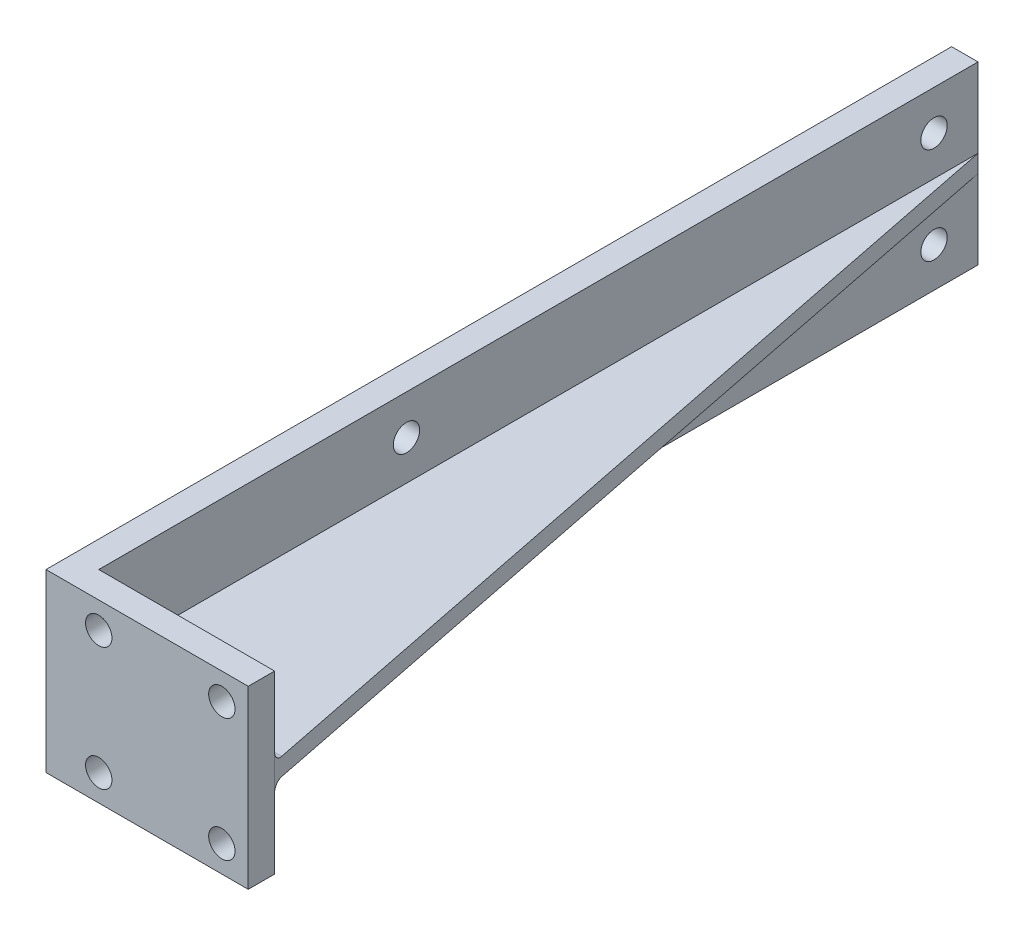
ISO-10303-21;
HEADER;
FILE_DESCRIPTION(('STEP AP214'),'2;1');
FILE_NAME('part.step','',(''),(''),'','','');
FILE_SCHEMA(('AUTOMOTIVE_DESIGN { 1 0 10303 214 1 1 1 1 }'));
ENDSEC;
DATA;
#1=APPLICATION_CONTEXT('core data for automotive mechanical design processes');
#2=APPLICATION_PROTOCOL_DEFINITION('international standard','automotive_design',2000,#1);
#3=PRODUCT_CONTEXT('',#1,'mechanical');
#4=PRODUCT('Part','Part','',(#3));
#5=PRODUCT_RELATED_PRODUCT_CATEGORY('part','',(#4));
#6=PRODUCT_DEFINITION_FORMATION('','',#4);
#7=PRODUCT_DEFINITION_CONTEXT('part definition',#1,'design');
#8=PRODUCT_DEFINITION('design','',#6,#7);
#9=PRODUCT_DEFINITION_SHAPE('','',#8);
#10=(LENGTH_UNIT() NAMED_UNIT(*) SI_UNIT(.MILLI.,.METRE.));
#11=(NAMED_UNIT(*) PLANE_ANGLE_UNIT() SI_UNIT($,.RADIAN.));
#12=(NAMED_UNIT(*) SI_UNIT($,.STERADIAN.) SOLID_ANGLE_UNIT());
#13=UNCERTAINTY_MEASURE_WITH_UNIT(LENGTH_MEASURE(1.E-05),#10,'distance_accuracy_value','');
#14=(GEOMETRIC_REPRESENTATION_CONTEXT(3) GLOBAL_UNCERTAINTY_ASSIGNED_CONTEXT((#13)) GLOBAL_UNIT_ASSIGNED_CONTEXT((#10,
#11,#12)) REPRESENTATION_CONTEXT('',''));
#15=CARTESIAN_POINT('',(0.,0.,0.));
#16=DIRECTION('',(0.,0.,1.));
#17=DIRECTION('',(1.,0.,0.));
#18=AXIS2_PLACEMENT_3D('',#15,#16,#17);
#19=CARTESIAN_POINT('',(20.,2.,0.));
#20=DIRECTION('',(-0.98058067569092,0.,0.196116135138184));
#21=DIRECTION('',(0.196116135138184,0.,0.98058067569092));
#22=AXIS2_PLACEMENT_3D('',#19,#20,#21);
#23=PLANE('',#22);
#24=DIRECTION('',(0.,-1.,0.));
#25=VECTOR('',#24,1.);
#26=CARTESIAN_POINT('',(20.,2.,0.));
#27=LINE('',#26,#25);
#28=CARTESIAN_POINT('',(20.,3.,0.));
#29=VERTEX_POINT('',#28);
#30=CARTESIAN_POINT('',(20.,-1.,0.));
#31=VERTEX_POINT('',#30);
#32=EDGE_CURVE('E51',#29,#31,#27,.T.);
#33=ORIENTED_EDGE('',*,*,#32,.T.);
#34=CARTESIAN_POINT('',(19.8,-1.,-1.));
#35=DIRECTION('',(-0.98058067569092,0.,0.196116135138184));
#36=DIRECTION('',(-0.196116135138184,0.,-0.98058067569092));
#37=AXIS2_PLACEMENT_3D('',#34,#35,#36);
#38=ELLIPSE('',#37,1.01980390271856,1.);
#39=CARTESIAN_POINT('',(19.8,0.,-1.));
#40=VERTEX_POINT('',#39);
#41=EDGE_CURVE('E11',#31,#40,#38,.T.);
#42=ORIENTED_EDGE('',*,*,#41,.T.);
#43=DIRECTION('',(-0.196116135138184,0.,-0.98058067569092));
#44=VECTOR('',#43,1.);
#45=CARTESIAN_POINT('',(20.,0.,0.));
#46=LINE('',#45,#44);
#47=CARTESIAN_POINT('',(0.,0.,-100.));
#48=VERTEX_POINT('',#47);
#49=EDGE_CURVE('E172',#40,#48,#46,.T.);
#50=ORIENTED_EDGE('',*,*,#49,.T.);
#51=DIRECTION('',(0.,-1.,0.));
#52=VECTOR('',#51,1.);
#53=CARTESIAN_POINT('',(0.,2.,-100.));
#54=LINE('',#53,#52);
#55=CARTESIAN_POINT('',(0.,2.,-100.));
#56=VERTEX_POINT('',#55);
#57=EDGE_CURVE('E193',#56,#48,#54,.T.);
#58=ORIENTED_EDGE('',*,*,#57,.F.);
#59=DIRECTION('',(-0.196116135138184,0.,-0.98058067569092));
#60=VECTOR('',#59,1.);
#61=CARTESIAN_POINT('',(20.,2.,0.));
#62=LINE('',#61,#60);
#63=CARTESIAN_POINT('',(19.8,2.,-1.));
#64=VERTEX_POINT('',#63);
#65=EDGE_CURVE('E183',#64,#56,#62,.T.);
#66=ORIENTED_EDGE('',*,*,#65,.F.);
#67=CARTESIAN_POINT('',(19.8,3.,-1.));
#68=DIRECTION('',(-0.98058067569092,0.,0.196116135138184));
#69=DIRECTION('',(0.196116135138184,0.,0.98058067569092));
#70=AXIS2_PLACEMENT_3D('',#67,#68,#69);
#71=ELLIPSE('',#70,1.01980390271856,1.);
#72=EDGE_CURVE('E44',#64,#29,#71,.T.);
#73=ORIENTED_EDGE('',*,*,#72,.T.);
#74=EDGE_LOOP('',(#33,#42,#50,#58,#66,#73));
#75=FACE_BOUND('',#74,.T.);
#76=ADVANCED_FACE('F35',(#75),#23,.F.);
#77=CARTESIAN_POINT('',(0.,2.,0.));
#78=DIRECTION('',(0.,-1.,0.));
#79=DIRECTION('',(0.,0.,-1.));
#80=AXIS2_PLACEMENT_3D('',#77,#78,#79);
#81=PLANE('',#80);
#82=DIRECTION('',(0.,0.,1.));
#83=VECTOR('',#82,1.);
#84=CARTESIAN_POINT('',(0.,2.,-100.));
#85=LINE('',#84,#83);
#86=CARTESIAN_POINT('',(0.,2.,-1.));
#87=VERTEX_POINT('',#86);
#88=EDGE_CURVE('E185',#56,#87,#85,.T.);
#89=ORIENTED_EDGE('',*,*,#88,.T.);
#90=DIRECTION('',(1.,0.,0.));
#91=VECTOR('',#90,1.);
#92=CARTESIAN_POINT('',(0.,2.,-1.));
#93=LINE('',#92,#91);
#94=EDGE_CURVE('E196',#87,#64,#93,.T.);
#95=ORIENTED_EDGE('',*,*,#94,.T.);
#96=ORIENTED_EDGE('',*,*,#65,.T.);
#97=EDGE_LOOP('',(#89,#95,#96));
#98=FACE_BOUND('',#97,.T.);
#99=ADVANCED_FACE('F249',(#98),#81,.F.);
#100=CARTESIAN_POINT('',(0.,0.,0.));
#101=DIRECTION('',(0.,-1.,0.));
#102=DIRECTION('',(0.,0.,-1.));
#103=AXIS2_PLACEMENT_3D('',#100,#101,#102);
#104=PLANE('',#103);
#105=ORIENTED_EDGE('',*,*,#49,.F.);
#106=DIRECTION('',(1.,0.,0.));
#107=VECTOR('',#106,1.);
#108=CARTESIAN_POINT('',(0.,0.,-1.));
#109=LINE('',#108,#107);
#110=CARTESIAN_POINT('',(0.,0.,-1.));
#111=VERTEX_POINT('',#110);
#112=EDGE_CURVE('E204',#40,#111,#109,.F.);
#113=ORIENTED_EDGE('',*,*,#112,.T.);
#114=DIRECTION('',(0.,0.,1.));
#115=VECTOR('',#114,1.);
#116=CARTESIAN_POINT('',(0.,0.,-100.));
#117=LINE('',#116,#115);
#118=EDGE_CURVE('E186',#48,#111,#117,.T.);
#119=ORIENTED_EDGE('',*,*,#118,.F.);
#120=EDGE_LOOP('',(#105,#113,#119));
#121=FACE_BOUND('',#120,.T.);
#122=ADVANCED_FACE('F247',(#121),#104,.T.);
#123=CARTESIAN_POINT('',(20.,11.,0.));
#124=DIRECTION('',(0.,0.,-1.));
#125=DIRECTION('',(-1.,0.,0.));
#126=AXIS2_PLACEMENT_3D('',#123,#124,#125);
#127=PLANE('',#126);
#128=CARTESIAN_POINT('',(3.,8.,0.));
#129=DIRECTION('',(0.,0.,-1.));
#130=DIRECTION('',(1.,0.,0.));
#131=AXIS2_PLACEMENT_3D('',#128,#129,#130);
#132=CIRCLE('',#131,1.5);
#133=CARTESIAN_POINT('',(4.5,8.,0.));
#134=VERTEX_POINT('',#133);
#135=EDGE_CURVE('E345',#134,#134,#132,.T.);
#136=ORIENTED_EDGE('',*,*,#135,.F.);
#137=EDGE_LOOP('',(#136));
#138=FACE_BOUND('',#137,.T.);
#139=CARTESIAN_POINT('',(17.,8.,0.));
#140=DIRECTION('',(0.,0.,-1.));
#141=DIRECTION('',(-1.,0.,0.));
#142=AXIS2_PLACEMENT_3D('',#139,#140,#141);
#143=CIRCLE('',#142,1.5);
#144=CARTESIAN_POINT('',(15.5,8.,0.));
#145=VERTEX_POINT('',#144);
#146=EDGE_CURVE('E336',#145,#145,#143,.T.);
#147=ORIENTED_EDGE('',*,*,#146,.F.);
#148=EDGE_LOOP('',(#147));
#149=FACE_BOUND('',#148,.T.);
#150=DIRECTION('',(0.,-1.,0.));
#151=VECTOR('',#150,1.);
#152=CARTESIAN_POINT('',(20.,11.,0.));
#153=LINE('',#152,#151);
#154=CARTESIAN_POINT('',(20.,11.,0.));
#155=VERTEX_POINT('',#154);
#156=EDGE_CURVE('E121',#155,#29,#153,.T.);
#157=ORIENTED_EDGE('',*,*,#156,.T.);
#158=DIRECTION('',(1.,0.,0.));
#159=VECTOR('',#158,1.);
#160=CARTESIAN_POINT('',(20.,3.,0.));
#161=LINE('',#160,#159);
#162=CARTESIAN_POINT('',(0.,3.,0.));
#163=VERTEX_POINT('',#162);
#164=EDGE_CURVE('E199',#29,#163,#161,.F.);
#165=ORIENTED_EDGE('',*,*,#164,.T.);
#166=DIRECTION('',(0.,-1.,0.));
#167=VECTOR('',#166,1.);
#168=CARTESIAN_POINT('',(0.,11.,0.));
#169=LINE('',#168,#167);
#170=CARTESIAN_POINT('',(0.,11.,0.));
#171=VERTEX_POINT('',#170);
#172=EDGE_CURVE('E169',#171,#163,#169,.T.);
#173=ORIENTED_EDGE('',*,*,#172,.F.);
#174=DIRECTION('',(1.,0.,0.));
#175=VECTOR('',#174,1.);
#176=CARTESIAN_POINT('',(20.,11.,0.));
#177=LINE('',#176,#175);
#178=EDGE_CURVE('E153',#171,#155,#177,.T.);
#179=ORIENTED_EDGE('',*,*,#178,.T.);
#180=EDGE_LOOP('',(#157,#165,#173,#179));
#181=FACE_BOUND('',#180,.T.);
#182=ADVANCED_FACE('F218',(#138,#149,#181),#127,.T.);
#183=CARTESIAN_POINT('',(0.,11.,0.));
#184=DIRECTION('',(1.,0.,0.));
#185=DIRECTION('',(0.,0.,-1.));
#186=AXIS2_PLACEMENT_3D('',#183,#184,#185);
#187=PLANE('',#186);
#188=CARTESIAN_POINT('',(0.,6.49999999999999,-35.));
#189=DIRECTION('',(1.,0.,0.));
#190=DIRECTION('',(0.,0.,-1.));
#191=AXIS2_PLACEMENT_3D('',#188,#189,#190);
#192=CIRCLE('',#191,1.5);
#193=CARTESIAN_POINT('',(0.,6.49999999999999,-36.5));
#194=VERTEX_POINT('',#193);
#195=EDGE_CURVE('E363',#194,#194,#192,.T.);
#196=ORIENTED_EDGE('',*,*,#195,.F.);
#197=EDGE_LOOP('',(#196));
#198=FACE_BOUND('',#197,.T.);
#199=CARTESIAN_POINT('',(0.,6.5,-95.));
#200=DIRECTION('',(1.,0.,0.));
#201=DIRECTION('',(0.,0.,-1.));
#202=AXIS2_PLACEMENT_3D('',#199,#200,#201);
#203=CIRCLE('',#202,1.5);
#204=CARTESIAN_POINT('',(0.,6.5,-96.5));
#205=VERTEX_POINT('',#204);
#206=EDGE_CURVE('E142',#205,#205,#203,.T.);
#207=ORIENTED_EDGE('',*,*,#206,.F.);
#208=EDGE_LOOP('',(#207));
#209=FACE_BOUND('',#208,.T.);
#210=ORIENTED_EDGE('',*,*,#172,.T.);
#211=CARTESIAN_POINT('',(0.,3.,-1.));
#212=DIRECTION('',(1.,0.,0.));
#213=DIRECTION('',(0.,0.,-1.));
#214=AXIS2_PLACEMENT_3D('',#211,#212,#213);
#215=CIRCLE('',#214,1.);
#216=EDGE_CURVE('E201',#163,#87,#215,.T.);
#217=ORIENTED_EDGE('',*,*,#216,.T.);
#218=ORIENTED_EDGE('',*,*,#88,.F.);
#219=DIRECTION('',(0.,-1.,0.));
#220=VECTOR('',#219,1.);
#221=CARTESIAN_POINT('',(0.,11.,-100.));
#222=LINE('',#221,#220);
#223=CARTESIAN_POINT('',(0.,11.,-100.));
#224=VERTEX_POINT('',#223);
#225=EDGE_CURVE('E174',#224,#56,#222,.T.);
#226=ORIENTED_EDGE('',*,*,#225,.F.);
#227=DIRECTION('',(0.,0.,1.));
#228=VECTOR('',#227,1.);
#229=CARTESIAN_POINT('',(0.,11.,0.));
#230=LINE('',#229,#228);
#231=EDGE_CURVE('E122',#224,#171,#230,.T.);
#232=ORIENTED_EDGE('',*,*,#231,.T.);
#233=EDGE_LOOP('',(#210,#217,#218,#226,#232));
#234=FACE_BOUND('',#233,.T.);
#235=ADVANCED_FACE('F221',(#198,#209,#234),#187,.T.);
#236=CARTESIAN_POINT('',(3.,-6.,0.));
#237=DIRECTION('',(0.,0.,-1.));
#238=DIRECTION('',(-1.,0.,0.));
#239=AXIS2_PLACEMENT_3D('',#236,#237,#238);
#240=CIRCLE('',#239,1.5);
#241=CARTESIAN_POINT('',(1.5,-6.,0.));
#242=VERTEX_POINT('',#241);
#243=EDGE_CURVE('E327',#242,#242,#240,.T.);
#244=ORIENTED_EDGE('',*,*,#243,.F.);
#245=EDGE_LOOP('',(#244));
#246=FACE_BOUND('',#245,.T.);
#247=CARTESIAN_POINT('',(17.,-6.,0.));
#248=DIRECTION('',(0.,0.,-1.));
#249=DIRECTION('',(1.,0.,0.));
#250=AXIS2_PLACEMENT_3D('',#247,#248,#249);
#251=CIRCLE('',#250,1.5);
#252=CARTESIAN_POINT('',(18.5,-6.,0.));
#253=VERTEX_POINT('',#252);
#254=EDGE_CURVE('E330',#253,#253,#251,.T.);
#255=ORIENTED_EDGE('',*,*,#254,.F.);
#256=EDGE_LOOP('',(#255));
#257=FACE_BOUND('',#256,.T.);
#258=CARTESIAN_POINT('',(0.,-1.,0.));
#259=VERTEX_POINT('',#258);
#260=CARTESIAN_POINT('',(0.,-9.,0.));
#261=VERTEX_POINT('',#260);
#262=EDGE_CURVE('E173',#259,#261,#169,.T.);
#263=ORIENTED_EDGE('',*,*,#262,.F.);
#264=DIRECTION('',(1.,0.,0.));
#265=VECTOR('',#264,1.);
#266=CARTESIAN_POINT('',(20.,-1.,0.));
#267=LINE('',#266,#265);
#268=EDGE_CURVE('E120',#259,#31,#267,.T.);
#269=ORIENTED_EDGE('',*,*,#268,.T.);
#270=CARTESIAN_POINT('',(20.,-9.,0.));
#271=VERTEX_POINT('',#270);
#272=EDGE_CURVE('E113',#31,#271,#153,.T.);
#273=ORIENTED_EDGE('',*,*,#272,.T.);
#274=DIRECTION('',(1.,0.,0.));
#275=VECTOR('',#274,1.);
#276=CARTESIAN_POINT('',(20.,-9.,0.));
#277=LINE('',#276,#275);
#278=EDGE_CURVE('E118',#261,#271,#277,.T.);
#279=ORIENTED_EDGE('',*,*,#278,.F.);
#280=EDGE_LOOP('',(#263,#269,#273,#279));
#281=FACE_BOUND('',#280,.T.);
#282=ADVANCED_FACE('F116',(#246,#257,#281),#127,.T.);
#283=CARTESIAN_POINT('',(0.,-4.5,-95.));
#284=DIRECTION('',(1.,0.,0.));
#285=DIRECTION('',(0.,0.,1.));
#286=AXIS2_PLACEMENT_3D('',#283,#284,#285);
#287=CIRCLE('',#286,1.5);
#288=CARTESIAN_POINT('',(0.,-4.5,-93.5));
#289=VERTEX_POINT('',#288);
#290=EDGE_CURVE('E357',#289,#289,#287,.T.);
#291=ORIENTED_EDGE('',*,*,#290,.F.);
#292=EDGE_LOOP('',(#291));
#293=FACE_BOUND('',#292,.T.);
#294=CARTESIAN_POINT('',(0.,-4.50000000000001,-35.));
#295=DIRECTION('',(1.,0.,0.));
#296=DIRECTION('',(0.,0.,1.));
#297=AXIS2_PLACEMENT_3D('',#294,#295,#296);
#298=CIRCLE('',#297,1.5);
#299=CARTESIAN_POINT('',(0.,-4.50000000000001,-33.5));
#300=VERTEX_POINT('',#299);
#301=EDGE_CURVE('E351',#300,#300,#298,.T.);
#302=ORIENTED_EDGE('',*,*,#301,.F.);
#303=EDGE_LOOP('',(#302));
#304=FACE_BOUND('',#303,.T.);
#305=ORIENTED_EDGE('',*,*,#118,.T.);
#306=CARTESIAN_POINT('',(0.,-1.,-1.));
#307=DIRECTION('',(1.,0.,0.));
#308=DIRECTION('',(0.,0.,-1.));
#309=AXIS2_PLACEMENT_3D('',#306,#307,#308);
#310=CIRCLE('',#309,1.);
#311=EDGE_CURVE('E206',#111,#259,#310,.T.);
#312=ORIENTED_EDGE('',*,*,#311,.T.);
#313=ORIENTED_EDGE('',*,*,#262,.T.);
#314=DIRECTION('',(0.,0.,1.));
#315=VECTOR('',#314,1.);
#316=CARTESIAN_POINT('',(0.,-9.,0.));
#317=LINE('',#316,#315);
#318=CARTESIAN_POINT('',(0.,-9.,-100.));
#319=VERTEX_POINT('',#318);
#320=EDGE_CURVE('E138',#319,#261,#317,.T.);
#321=ORIENTED_EDGE('',*,*,#320,.F.);
#322=EDGE_CURVE('E177',#48,#319,#222,.T.);
#323=ORIENTED_EDGE('',*,*,#322,.F.);
#324=EDGE_LOOP('',(#305,#312,#313,#321,#323));
#325=FACE_BOUND('',#324,.T.);
#326=ADVANCED_FACE('F240',(#293,#304,#325),#187,.T.);
#327=CARTESIAN_POINT('',(0.,11.,-100.));
#328=DIRECTION('',(0.,0.,-1.));
#329=DIRECTION('',(-1.,0.,0.));
#330=AXIS2_PLACEMENT_3D('',#327,#328,#329);
#331=PLANE('',#330);
#332=ORIENTED_EDGE('',*,*,#225,.T.);
#333=ORIENTED_EDGE('',*,*,#57,.T.);
#334=ORIENTED_EDGE('',*,*,#322,.T.);
#335=DIRECTION('',(1.,0.,0.));
#336=VECTOR('',#335,1.);
#337=CARTESIAN_POINT('',(0.,-9.,-100.));
#338=LINE('',#337,#336);
#339=CARTESIAN_POINT('',(-2.99999999999999,-9.,-100.));
#340=VERTEX_POINT('',#339);
#341=EDGE_CURVE('E150',#340,#319,#338,.T.);
#342=ORIENTED_EDGE('',*,*,#341,.F.);
#343=DIRECTION('',(0.,-1.,0.));
#344=VECTOR('',#343,1.);
#345=CARTESIAN_POINT('',(-2.99999999999999,11.,-100.));
#346=LINE('',#345,#344);
#347=CARTESIAN_POINT('',(-2.99999999999999,11.,-100.));
#348=VERTEX_POINT('',#347);
#349=EDGE_CURVE('E178',#348,#340,#346,.T.);
#350=ORIENTED_EDGE('',*,*,#349,.F.);
#351=DIRECTION('',(1.,0.,0.));
#352=VECTOR('',#351,1.);
#353=CARTESIAN_POINT('',(0.,11.,-100.));
#354=LINE('',#353,#352);
#355=EDGE_CURVE('E164',#348,#224,#354,.T.);
#356=ORIENTED_EDGE('',*,*,#355,.T.);
#357=EDGE_LOOP('',(#332,#333,#334,#342,#350,#356));
#358=FACE_BOUND('',#357,.T.);
#359=ADVANCED_FACE('F237',(#358),#331,.T.);
#360=CARTESIAN_POINT('',(-2.99999999999999,11.,-100.));
#361=DIRECTION('',(-1.,0.,0.));
#362=DIRECTION('',(0.,0.,1.));
#363=AXIS2_PLACEMENT_3D('',#360,#361,#362);
#364=PLANE('',#363);
#365=CARTESIAN_POINT('',(-3.00000000000001,6.49999999999999,-35.));
#366=DIRECTION('',(1.,0.,0.));
#367=DIRECTION('',(0.,0.,-1.));
#368=AXIS2_PLACEMENT_3D('',#365,#366,#367);
#369=CIRCLE('',#368,1.5);
#370=CARTESIAN_POINT('',(-3.00000000000001,6.49999999999999,-36.5));
#371=VERTEX_POINT('',#370);
#372=EDGE_CURVE('E360',#371,#371,#369,.T.);
#373=ORIENTED_EDGE('',*,*,#372,.T.);
#374=EDGE_LOOP('',(#373));
#375=FACE_BOUND('',#374,.T.);
#376=CARTESIAN_POINT('',(-3.00000000000001,-4.5,-95.));
#377=DIRECTION('',(1.,0.,0.));
#378=DIRECTION('',(0.,0.,1.));
#379=AXIS2_PLACEMENT_3D('',#376,#377,#378);
#380=CIRCLE('',#379,1.5);
#381=CARTESIAN_POINT('',(-3.00000000000001,-4.5,-93.5));
#382=VERTEX_POINT('',#381);
#383=EDGE_CURVE('E366',#382,#382,#380,.T.);
#384=ORIENTED_EDGE('',*,*,#383,.T.);
#385=EDGE_LOOP('',(#384));
#386=FACE_BOUND('',#385,.T.);
#387=CARTESIAN_POINT('',(-3.00000000000001,-4.50000000000001,-35.));
#388=DIRECTION('',(1.,0.,0.));
#389=DIRECTION('',(0.,0.,1.));
#390=AXIS2_PLACEMENT_3D('',#387,#388,#389);
#391=CIRCLE('',#390,1.5);
#392=CARTESIAN_POINT('',(-3.00000000000001,-4.50000000000001,-33.5));
#393=VERTEX_POINT('',#392);
#394=EDGE_CURVE('E354',#393,#393,#391,.T.);
#395=ORIENTED_EDGE('',*,*,#394,.T.);
#396=EDGE_LOOP('',(#395));
#397=FACE_BOUND('',#396,.T.);
#398=CARTESIAN_POINT('',(-3.00000000000001,6.5,-95.));
#399=DIRECTION('',(1.,0.,0.));
#400=DIRECTION('',(0.,0.,-1.));
#401=AXIS2_PLACEMENT_3D('',#398,#399,#400);
#402=CIRCLE('',#401,1.5);
#403=CARTESIAN_POINT('',(-3.00000000000001,6.5,-96.5));
#404=VERTEX_POINT('',#403);
#405=EDGE_CURVE('E139',#404,#404,#402,.T.);
#406=ORIENTED_EDGE('',*,*,#405,.T.);
#407=EDGE_LOOP('',(#406));
#408=FACE_BOUND('',#407,.T.);
#409=ORIENTED_EDGE('',*,*,#349,.T.);
#410=DIRECTION('',(0.,0.,-1.));
#411=VECTOR('',#410,1.);
#412=CARTESIAN_POINT('',(-2.99999999999999,-9.,-100.));
#413=LINE('',#412,#411);
#414=CARTESIAN_POINT('',(-3.00000000000001,-9.,3.));
#415=VERTEX_POINT('',#414);
#416=EDGE_CURVE('E147',#415,#340,#413,.T.);
#417=ORIENTED_EDGE('',*,*,#416,.F.);
#418=DIRECTION('',(0.,-1.,0.));
#419=VECTOR('',#418,1.);
#420=CARTESIAN_POINT('',(-3.00000000000001,11.,3.));
#421=LINE('',#420,#419);
#422=CARTESIAN_POINT('',(-3.00000000000001,11.,3.));
#423=VERTEX_POINT('',#422);
#424=EDGE_CURVE('E180',#423,#415,#421,.T.);
#425=ORIENTED_EDGE('',*,*,#424,.F.);
#426=DIRECTION('',(0.,0.,-1.));
#427=VECTOR('',#426,1.);
#428=CARTESIAN_POINT('',(-2.99999999999999,11.,-100.));
#429=LINE('',#428,#427);
#430=EDGE_CURVE('E161',#423,#348,#429,.T.);
#431=ORIENTED_EDGE('',*,*,#430,.T.);
#432=EDGE_LOOP('',(#409,#417,#425,#431));
#433=FACE_BOUND('',#432,.T.);
#434=ADVANCED_FACE('F235',(#375,#386,#397,#408,#433),#364,.T.);
#435=CARTESIAN_POINT('',(20.,11.,3.));
#436=DIRECTION('',(0.,0.,1.));
#437=DIRECTION('',(1.,0.,0.));
#438=AXIS2_PLACEMENT_3D('',#435,#436,#437);
#439=PLANE('',#438);
#440=CARTESIAN_POINT('',(3.,8.,3.));
#441=DIRECTION('',(0.,0.,-1.));
#442=DIRECTION('',(1.,0.,0.));
#443=AXIS2_PLACEMENT_3D('',#440,#441,#442);
#444=CIRCLE('',#443,1.5);
#445=CARTESIAN_POINT('',(4.5,8.,3.));
#446=VERTEX_POINT('',#445);
#447=EDGE_CURVE('E342',#446,#446,#444,.T.);
#448=ORIENTED_EDGE('',*,*,#447,.T.);
#449=EDGE_LOOP('',(#448));
#450=FACE_BOUND('',#449,.T.);
#451=CARTESIAN_POINT('',(3.,-6.,3.));
#452=DIRECTION('',(0.,0.,-1.));
#453=DIRECTION('',(-1.,0.,0.));
#454=AXIS2_PLACEMENT_3D('',#451,#452,#453);
#455=CIRCLE('',#454,1.5);
#456=CARTESIAN_POINT('',(1.5,-6.,3.));
#457=VERTEX_POINT('',#456);
#458=EDGE_CURVE('E333',#457,#457,#455,.T.);
#459=ORIENTED_EDGE('',*,*,#458,.T.);
#460=EDGE_LOOP('',(#459));
#461=FACE_BOUND('',#460,.T.);
#462=CARTESIAN_POINT('',(17.,-6.,3.));
#463=DIRECTION('',(0.,0.,-1.));
#464=DIRECTION('',(1.,0.,0.));
#465=AXIS2_PLACEMENT_3D('',#462,#463,#464);
#466=CIRCLE('',#465,1.5);
#467=CARTESIAN_POINT('',(18.5,-6.,3.));
#468=VERTEX_POINT('',#467);
#469=EDGE_CURVE('E332',#468,#468,#466,.T.);
#470=ORIENTED_EDGE('',*,*,#469,.T.);
#471=EDGE_LOOP('',(#470));
#472=FACE_BOUND('',#471,.T.);
#473=CARTESIAN_POINT('',(17.,8.,3.));
#474=DIRECTION('',(0.,0.,-1.));
#475=DIRECTION('',(-1.,0.,0.));
#476=AXIS2_PLACEMENT_3D('',#473,#474,#475);
#477=CIRCLE('',#476,1.5);
#478=CARTESIAN_POINT('',(15.5,8.,3.));
#479=VERTEX_POINT('',#478);
#480=EDGE_CURVE('E348',#479,#479,#477,.T.);
#481=ORIENTED_EDGE('',*,*,#480,.T.);
#482=EDGE_LOOP('',(#481));
#483=FACE_BOUND('',#482,.T.);
#484=ORIENTED_EDGE('',*,*,#424,.T.);
#485=DIRECTION('',(-1.,0.,0.));
#486=VECTOR('',#485,1.);
#487=CARTESIAN_POINT('',(20.,-9.,3.));
#488=LINE('',#487,#486);
#489=CARTESIAN_POINT('',(20.,-9.,3.));
#490=VERTEX_POINT('',#489);
#491=EDGE_CURVE('E132',#490,#415,#488,.T.);
#492=ORIENTED_EDGE('',*,*,#491,.F.);
#493=DIRECTION('',(0.,-1.,0.));
#494=VECTOR('',#493,1.);
#495=CARTESIAN_POINT('',(20.,11.,3.));
#496=LINE('',#495,#494);
#497=CARTESIAN_POINT('',(20.,11.,3.));
#498=VERTEX_POINT('',#497);
#499=EDGE_CURVE('E128',#498,#490,#496,.T.);
#500=ORIENTED_EDGE('',*,*,#499,.F.);
#501=DIRECTION('',(-1.,0.,0.));
#502=VECTOR('',#501,1.);
#503=CARTESIAN_POINT('',(20.,11.,3.));
#504=LINE('',#503,#502);
#505=EDGE_CURVE('E158',#498,#423,#504,.T.);
#506=ORIENTED_EDGE('',*,*,#505,.T.);
#507=EDGE_LOOP('',(#484,#492,#500,#506));
#508=FACE_BOUND('',#507,.T.);
#509=ADVANCED_FACE('F231',(#450,#461,#472,#483,#508),#439,.T.);
#510=CARTESIAN_POINT('',(20.,11.,0.));
#511=DIRECTION('',(1.,0.,0.));
#512=DIRECTION('',(0.,0.,-1.));
#513=AXIS2_PLACEMENT_3D('',#510,#511,#512);
#514=PLANE('',#513);
#515=ORIENTED_EDGE('',*,*,#499,.T.);
#516=DIRECTION('',(0.,0.,1.));
#517=VECTOR('',#516,1.);
#518=CARTESIAN_POINT('',(20.,-9.,0.));
#519=LINE('',#518,#517);
#520=EDGE_CURVE('E125',#271,#490,#519,.T.);
#521=ORIENTED_EDGE('',*,*,#520,.F.);
#522=ORIENTED_EDGE('',*,*,#272,.F.);
#523=ORIENTED_EDGE('',*,*,#32,.F.);
#524=ORIENTED_EDGE('',*,*,#156,.F.);
#525=DIRECTION('',(0.,0.,1.));
#526=VECTOR('',#525,1.);
#527=CARTESIAN_POINT('',(20.,11.,0.));
#528=LINE('',#527,#526);
#529=EDGE_CURVE('E156',#155,#498,#528,.T.);
#530=ORIENTED_EDGE('',*,*,#529,.T.);
#531=EDGE_LOOP('',(#515,#521,#522,#523,#524,#530));
#532=FACE_BOUND('',#531,.T.);
#533=ADVANCED_FACE('F126',(#532),#514,.T.);
#534=CARTESIAN_POINT('',(0.,11.,0.));
#535=DIRECTION('',(0.,-1.,0.));
#536=DIRECTION('',(0.,0.,-1.));
#537=AXIS2_PLACEMENT_3D('',#534,#535,#536);
#538=PLANE('',#537);
#539=ORIENTED_EDGE('',*,*,#178,.F.);
#540=ORIENTED_EDGE('',*,*,#231,.F.);
#541=ORIENTED_EDGE('',*,*,#355,.F.);
#542=ORIENTED_EDGE('',*,*,#430,.F.);
#543=ORIENTED_EDGE('',*,*,#505,.F.);
#544=ORIENTED_EDGE('',*,*,#529,.F.);
#545=EDGE_LOOP('',(#539,#540,#541,#542,#543,#544));
#546=FACE_BOUND('',#545,.T.);
#547=ADVANCED_FACE('F226',(#546),#538,.F.);
#548=CARTESIAN_POINT('',(0.,-9.,0.));
#549=DIRECTION('',(0.,-1.,0.));
#550=DIRECTION('',(0.,0.,-1.));
#551=AXIS2_PLACEMENT_3D('',#548,#549,#550);
#552=PLANE('',#551);
#553=ORIENTED_EDGE('',*,*,#278,.T.);
#554=ORIENTED_EDGE('',*,*,#520,.T.);
#555=ORIENTED_EDGE('',*,*,#491,.T.);
#556=ORIENTED_EDGE('',*,*,#416,.T.);
#557=ORIENTED_EDGE('',*,*,#341,.T.);
#558=ORIENTED_EDGE('',*,*,#320,.T.);
#559=EDGE_LOOP('',(#553,#554,#555,#556,#557,#558));
#560=FACE_BOUND('',#559,.T.);
#561=ADVANCED_FACE('F135',(#560),#552,.T.);
#562=CARTESIAN_POINT('',(-3.00000000000001,6.5,-95.));
#563=DIRECTION('',(1.,0.,0.));
#564=DIRECTION('',(0.,0.,-1.));
#565=AXIS2_PLACEMENT_3D('',#562,#563,#564);
#566=CYLINDRICAL_SURFACE('',#565,1.5);
#567=ORIENTED_EDGE('',*,*,#405,.F.);
#568=EDGE_LOOP('',(#567));
#569=FACE_BOUND('',#568,.T.);
#570=ORIENTED_EDGE('',*,*,#206,.T.);
#571=EDGE_LOOP('',(#570));
#572=FACE_BOUND('',#571,.T.);
#573=ADVANCED_FACE('F291',(#569,#572),#566,.F.);
#574=CARTESIAN_POINT('',(-3.00000000000001,-4.50000000000001,-35.));
#575=DIRECTION('',(1.,0.,0.));
#576=DIRECTION('',(0.,0.,-1.));
#577=AXIS2_PLACEMENT_3D('',#574,#575,#576);
#578=CYLINDRICAL_SURFACE('',#577,1.5);
#579=ORIENTED_EDGE('',*,*,#394,.F.);
#580=EDGE_LOOP('',(#579));
#581=FACE_BOUND('',#580,.T.);
#582=ORIENTED_EDGE('',*,*,#301,.T.);
#583=EDGE_LOOP('',(#582));
#584=FACE_BOUND('',#583,.T.);
#585=ADVANCED_FACE('F287',(#581,#584),#578,.F.);
#586=CARTESIAN_POINT('',(-3.00000000000001,-4.5,-95.));
#587=DIRECTION('',(1.,0.,0.));
#588=DIRECTION('',(0.,0.,-1.));
#589=AXIS2_PLACEMENT_3D('',#586,#587,#588);
#590=CYLINDRICAL_SURFACE('',#589,1.5);
#591=ORIENTED_EDGE('',*,*,#383,.F.);
#592=EDGE_LOOP('',(#591));
#593=FACE_BOUND('',#592,.T.);
#594=ORIENTED_EDGE('',*,*,#290,.T.);
#595=EDGE_LOOP('',(#594));
#596=FACE_BOUND('',#595,.T.);
#597=ADVANCED_FACE('F290',(#593,#596),#590,.F.);
#598=CARTESIAN_POINT('',(-3.00000000000001,6.49999999999999,-35.));
#599=DIRECTION('',(1.,0.,0.));
#600=DIRECTION('',(0.,0.,-1.));
#601=AXIS2_PLACEMENT_3D('',#598,#599,#600);
#602=CYLINDRICAL_SURFACE('',#601,1.5);
#603=ORIENTED_EDGE('',*,*,#372,.F.);
#604=EDGE_LOOP('',(#603));
#605=FACE_BOUND('',#604,.T.);
#606=ORIENTED_EDGE('',*,*,#195,.T.);
#607=EDGE_LOOP('',(#606));
#608=FACE_BOUND('',#607,.T.);
#609=ADVANCED_FACE('F285',(#605,#608),#602,.F.);
#610=CARTESIAN_POINT('',(17.,8.,3.));
#611=DIRECTION('',(0.,0.,-1.));
#612=DIRECTION('',(-1.,0.,0.));
#613=AXIS2_PLACEMENT_3D('',#610,#611,#612);
#614=CYLINDRICAL_SURFACE('',#613,1.5);
#615=ORIENTED_EDGE('',*,*,#480,.F.);
#616=EDGE_LOOP('',(#615));
#617=FACE_BOUND('',#616,.T.);
#618=ORIENTED_EDGE('',*,*,#146,.T.);
#619=EDGE_LOOP('',(#618));
#620=FACE_BOUND('',#619,.T.);
#621=ADVANCED_FACE('F282',(#617,#620),#614,.F.);
#622=CARTESIAN_POINT('',(17.,-6.,3.));
#623=DIRECTION('',(0.,0.,-1.));
#624=DIRECTION('',(-1.,0.,0.));
#625=AXIS2_PLACEMENT_3D('',#622,#623,#624);
#626=CYLINDRICAL_SURFACE('',#625,1.5);
#627=ORIENTED_EDGE('',*,*,#469,.F.);
#628=EDGE_LOOP('',(#627));
#629=FACE_BOUND('',#628,.T.);
#630=ORIENTED_EDGE('',*,*,#254,.T.);
#631=EDGE_LOOP('',(#630));
#632=FACE_BOUND('',#631,.T.);
#633=ADVANCED_FACE('F275',(#629,#632),#626,.F.);
#634=CARTESIAN_POINT('',(3.,-6.,3.));
#635=DIRECTION('',(0.,0.,-1.));
#636=DIRECTION('',(-1.,0.,0.));
#637=AXIS2_PLACEMENT_3D('',#634,#635,#636);
#638=CYLINDRICAL_SURFACE('',#637,1.5);
#639=ORIENTED_EDGE('',*,*,#458,.F.);
#640=EDGE_LOOP('',(#639));
#641=FACE_BOUND('',#640,.T.);
#642=ORIENTED_EDGE('',*,*,#243,.T.);
#643=EDGE_LOOP('',(#642));
#644=FACE_BOUND('',#643,.T.);
#645=ADVANCED_FACE('F269',(#641,#644),#638,.F.);
#646=CARTESIAN_POINT('',(3.,8.,3.));
#647=DIRECTION('',(0.,0.,-1.));
#648=DIRECTION('',(-1.,0.,0.));
#649=AXIS2_PLACEMENT_3D('',#646,#647,#648);
#650=CYLINDRICAL_SURFACE('',#649,1.5);
#651=ORIENTED_EDGE('',*,*,#447,.F.);
#652=EDGE_LOOP('',(#651));
#653=FACE_BOUND('',#652,.T.);
#654=ORIENTED_EDGE('',*,*,#135,.T.);
#655=EDGE_LOOP('',(#654));
#656=FACE_BOUND('',#655,.T.);
#657=ADVANCED_FACE('F264',(#653,#656),#650,.F.);
#658=CARTESIAN_POINT('',(0.,3.,-1.));
#659=DIRECTION('',(1.,0.,0.));
#660=DIRECTION('',(0.,0.,-1.));
#661=AXIS2_PLACEMENT_3D('',#658,#659,#660);
#662=CYLINDRICAL_SURFACE('',#661,1.);
#663=ORIENTED_EDGE('',*,*,#216,.F.);
#664=ORIENTED_EDGE('',*,*,#164,.F.);
#665=ORIENTED_EDGE('',*,*,#72,.F.);
#666=ORIENTED_EDGE('',*,*,#94,.F.);
#667=EDGE_LOOP('',(#663,#664,#665,#666));
#668=FACE_BOUND('',#667,.T.);
#669=ADVANCED_FACE('F216',(#668),#662,.F.);
#670=CARTESIAN_POINT('',(20.,-1.,-1.));
#671=DIRECTION('',(-1.,0.,0.));
#672=DIRECTION('',(0.,0.,1.));
#673=AXIS2_PLACEMENT_3D('',#670,#671,#672);
#674=CYLINDRICAL_SURFACE('',#673,1.);
#675=ORIENTED_EDGE('',*,*,#311,.F.);
#676=ORIENTED_EDGE('',*,*,#112,.F.);
#677=ORIENTED_EDGE('',*,*,#41,.F.);
#678=ORIENTED_EDGE('',*,*,#268,.F.);
#679=EDGE_LOOP('',(#675,#676,#677,#678));
#680=FACE_BOUND('',#679,.T.);
#681=ADVANCED_FACE('F37',(#680),#674,.F.);
#682=CLOSED_SHELL('',(#76,#99,#122,#182,#235,#282,#326,#359,#434,#509,#533,#547,#561,#573,#585,
#597,#609,#621,#633,#645,#657,#669,#681));
#683=MANIFOLD_SOLID_BREP('B2',#682);
#684=ADVANCED_BREP_SHAPE_REPRESENTATION('',(#18,#683),#14);
#685=SHAPE_DEFINITION_REPRESENTATION(#9,#684);
ENDSEC;
END-ISO-10303-21;
